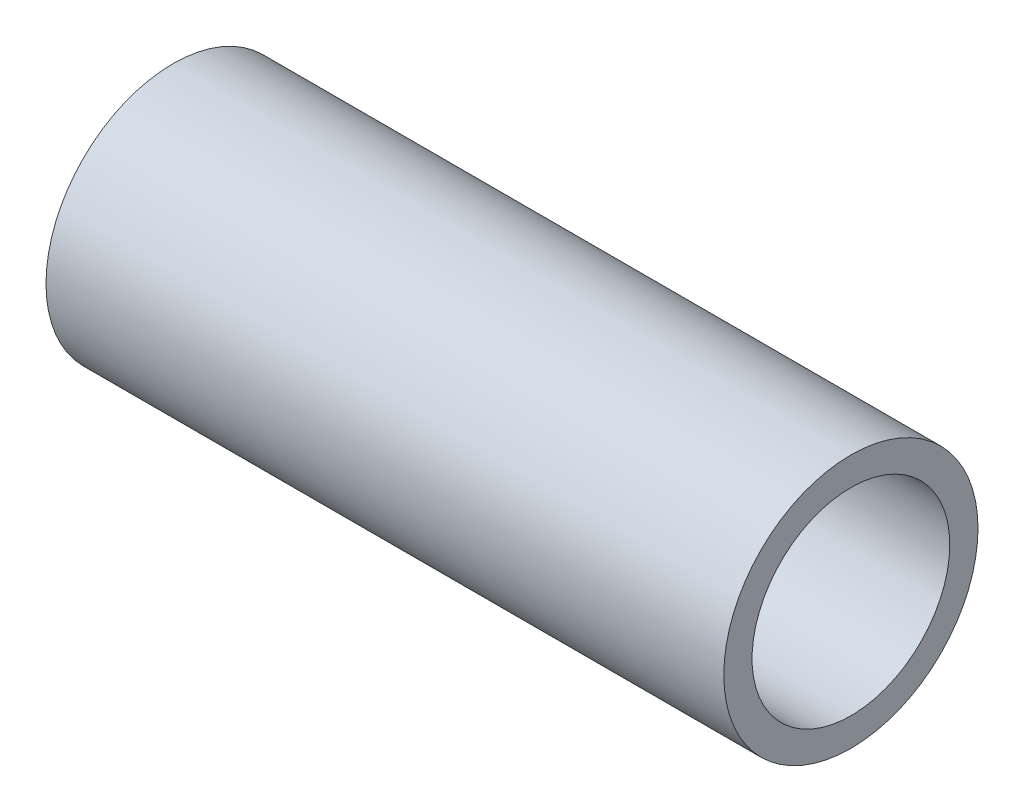
ISO-10303-21;
HEADER;
FILE_DESCRIPTION(('STEP AP214'),'2;1');
FILE_NAME('part.step','',(''),(''),'','','');
FILE_SCHEMA(('AUTOMOTIVE_DESIGN { 1 0 10303 214 1 1 1 1 }'));
ENDSEC;
DATA;
#1=APPLICATION_CONTEXT('core data for automotive mechanical design processes');
#2=APPLICATION_PROTOCOL_DEFINITION('international standard','automotive_design',2000,#1);
#3=PRODUCT_CONTEXT('',#1,'mechanical');
#4=PRODUCT('Part','Part','',(#3));
#5=PRODUCT_RELATED_PRODUCT_CATEGORY('part','',(#4));
#6=PRODUCT_DEFINITION_FORMATION('','',#4);
#7=PRODUCT_DEFINITION_CONTEXT('part definition',#1,'design');
#8=PRODUCT_DEFINITION('design','',#6,#7);
#9=PRODUCT_DEFINITION_SHAPE('','',#8);
#10=(LENGTH_UNIT() NAMED_UNIT(*) SI_UNIT(.MILLI.,.METRE.));
#11=(NAMED_UNIT(*) PLANE_ANGLE_UNIT() SI_UNIT($,.RADIAN.));
#12=(NAMED_UNIT(*) SI_UNIT($,.STERADIAN.) SOLID_ANGLE_UNIT());
#13=UNCERTAINTY_MEASURE_WITH_UNIT(LENGTH_MEASURE(1.E-05),#10,'distance_accuracy_value','');
#14=(GEOMETRIC_REPRESENTATION_CONTEXT(3) GLOBAL_UNCERTAINTY_ASSIGNED_CONTEXT((#13)) GLOBAL_UNIT_ASSIGNED_CONTEXT((#10,
#11,#12)) REPRESENTATION_CONTEXT('',''));
#15=CARTESIAN_POINT('',(0.,0.,0.));
#16=DIRECTION('',(0.,0.,1.));
#17=DIRECTION('',(1.,0.,0.));
#18=AXIS2_PLACEMENT_3D('',#15,#16,#17);
#19=CARTESIAN_POINT('',(24.,0.,0.));
#20=DIRECTION('',(1.,0.,0.));
#21=DIRECTION('',(0.,0.,-1.));
#22=AXIS2_PLACEMENT_3D('',#19,#20,#21);
#23=PLANE('',#22);
#24=CARTESIAN_POINT('',(24.,0.,0.));
#25=DIRECTION('',(1.,0.,0.));
#26=DIRECTION('',(0.,0.,-1.));
#27=AXIS2_PLACEMENT_3D('',#24,#25,#26);
#28=CIRCLE('',#27,9.);
#29=CARTESIAN_POINT('',(24.,0.,-9.));
#30=VERTEX_POINT('',#29);
#31=EDGE_CURVE('E10',#30,#30,#28,.T.);
#32=ORIENTED_EDGE('',*,*,#31,.T.);
#33=EDGE_LOOP('',(#32));
#34=FACE_BOUND('',#33,.T.);
#35=CARTESIAN_POINT('',(24.,0.,0.));
#36=DIRECTION('',(1.,0.,0.));
#37=DIRECTION('',(0.,0.,-1.));
#38=AXIS2_PLACEMENT_3D('',#35,#36,#37);
#39=CIRCLE('',#38,7.);
#40=CARTESIAN_POINT('',(24.,0.,-7.));
#41=VERTEX_POINT('',#40);
#42=EDGE_CURVE('E52',#41,#41,#39,.T.);
#43=ORIENTED_EDGE('',*,*,#42,.F.);
#44=EDGE_LOOP('',(#43));
#45=FACE_BOUND('',#44,.T.);
#46=ADVANCED_FACE('F41',(#34,#45),#23,.T.);
#47=CARTESIAN_POINT('',(-24.,0.,0.));
#48=DIRECTION('',(1.,0.,0.));
#49=DIRECTION('',(0.,0.,-1.));
#50=AXIS2_PLACEMENT_3D('',#47,#48,#49);
#51=PLANE('',#50);
#52=CARTESIAN_POINT('',(-24.,0.,0.));
#53=DIRECTION('',(1.,0.,0.));
#54=DIRECTION('',(0.,0.,-1.));
#55=AXIS2_PLACEMENT_3D('',#52,#53,#54);
#56=CIRCLE('',#55,9.);
#57=CARTESIAN_POINT('',(-24.,0.,-9.));
#58=VERTEX_POINT('',#57);
#59=EDGE_CURVE('E45',#58,#58,#56,.T.);
#60=ORIENTED_EDGE('',*,*,#59,.F.);
#61=EDGE_LOOP('',(#60));
#62=FACE_BOUND('',#61,.T.);
#63=CARTESIAN_POINT('',(-24.,0.,0.));
#64=DIRECTION('',(1.,0.,0.));
#65=DIRECTION('',(0.,0.,-1.));
#66=AXIS2_PLACEMENT_3D('',#63,#64,#65);
#67=CIRCLE('',#66,7.);
#68=CARTESIAN_POINT('',(-24.,0.,-7.));
#69=VERTEX_POINT('',#68);
#70=EDGE_CURVE('E54',#69,#69,#67,.T.);
#71=ORIENTED_EDGE('',*,*,#70,.T.);
#72=EDGE_LOOP('',(#71));
#73=FACE_BOUND('',#72,.T.);
#74=ADVANCED_FACE('F64',(#62,#73),#51,.F.);
#75=CARTESIAN_POINT('',(24.,0.,0.));
#76=DIRECTION('',(-1.,0.,0.));
#77=DIRECTION('',(0.,0.,1.));
#78=AXIS2_PLACEMENT_3D('',#75,#76,#77);
#79=CYLINDRICAL_SURFACE('',#78,9.);
#80=ORIENTED_EDGE('',*,*,#31,.F.);
#81=EDGE_LOOP('',(#80));
#82=FACE_BOUND('',#81,.T.);
#83=ORIENTED_EDGE('',*,*,#59,.T.);
#84=EDGE_LOOP('',(#83));
#85=FACE_BOUND('',#84,.T.);
#86=ADVANCED_FACE('F43',(#82,#85),#79,.T.);
#87=CARTESIAN_POINT('',(24.,0.,0.));
#88=DIRECTION('',(-1.,0.,0.));
#89=DIRECTION('',(0.,0.,1.));
#90=AXIS2_PLACEMENT_3D('',#87,#88,#89);
#91=CYLINDRICAL_SURFACE('',#90,7.);
#92=ORIENTED_EDGE('',*,*,#42,.T.);
#93=EDGE_LOOP('',(#92));
#94=FACE_BOUND('',#93,.T.);
#95=ORIENTED_EDGE('',*,*,#70,.F.);
#96=EDGE_LOOP('',(#95));
#97=FACE_BOUND('',#96,.T.);
#98=ADVANCED_FACE('F60',(#94,#97),#91,.F.);
#99=CLOSED_SHELL('',(#46,#74,#86,#98));
#100=MANIFOLD_SOLID_BREP('B2',#99);
#101=ADVANCED_BREP_SHAPE_REPRESENTATION('',(#18,#100),#14);
#102=SHAPE_DEFINITION_REPRESENTATION(#9,#101);
ENDSEC;
END-ISO-10303-21;
